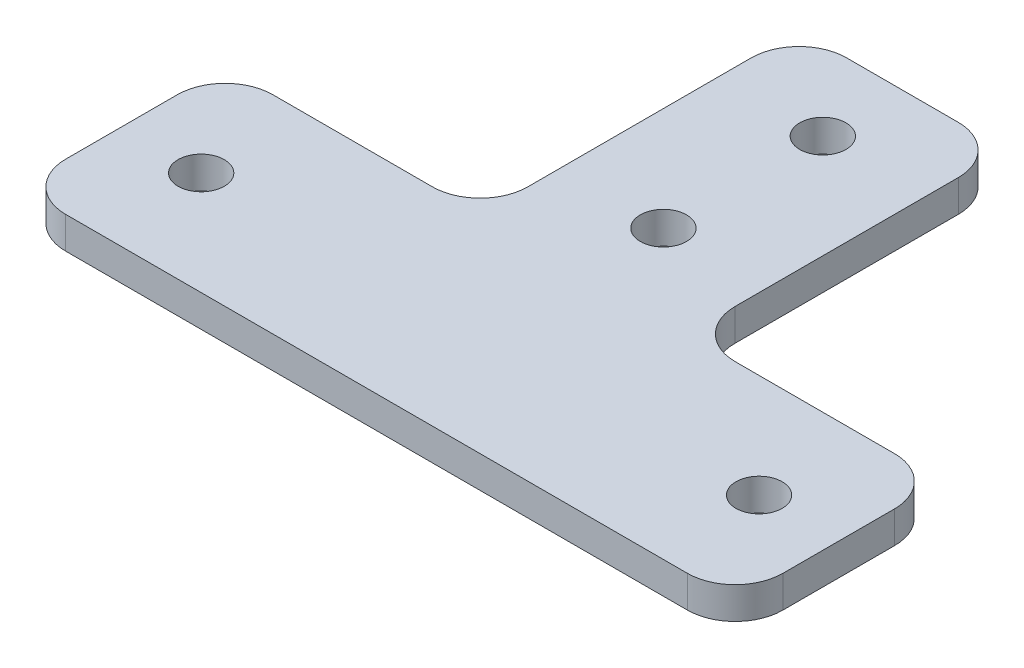
ISO-10303-21;
HEADER;
FILE_DESCRIPTION(('STEP AP214'),'2;1');
FILE_NAME('part.step','',(''),(''),'','','');
FILE_SCHEMA(('AUTOMOTIVE_DESIGN { 1 0 10303 214 1 1 1 1 }'));
ENDSEC;
DATA;
#1=APPLICATION_CONTEXT('core data for automotive mechanical design processes');
#2=APPLICATION_PROTOCOL_DEFINITION('international standard','automotive_design',2000,#1);
#3=PRODUCT_CONTEXT('',#1,'mechanical');
#4=PRODUCT('Part','Part','',(#3));
#5=PRODUCT_RELATED_PRODUCT_CATEGORY('part','',(#4));
#6=PRODUCT_DEFINITION_FORMATION('','',#4);
#7=PRODUCT_DEFINITION_CONTEXT('part definition',#1,'design');
#8=PRODUCT_DEFINITION('design','',#6,#7);
#9=PRODUCT_DEFINITION_SHAPE('','',#8);
#10=(LENGTH_UNIT() NAMED_UNIT(*) SI_UNIT(.MILLI.,.METRE.));
#11=(NAMED_UNIT(*) PLANE_ANGLE_UNIT() SI_UNIT($,.RADIAN.));
#12=(NAMED_UNIT(*) SI_UNIT($,.STERADIAN.) SOLID_ANGLE_UNIT());
#13=UNCERTAINTY_MEASURE_WITH_UNIT(LENGTH_MEASURE(1.E-05),#10,'distance_accuracy_value','');
#14=(GEOMETRIC_REPRESENTATION_CONTEXT(3) GLOBAL_UNCERTAINTY_ASSIGNED_CONTEXT((#13)) GLOBAL_UNIT_ASSIGNED_CONTEXT((#10,
#11,#12)) REPRESENTATION_CONTEXT('',''));
#15=CARTESIAN_POINT('',(0.,0.,0.));
#16=DIRECTION('',(0.,0.,1.));
#17=DIRECTION('',(1.,0.,0.));
#18=AXIS2_PLACEMENT_3D('',#15,#16,#17);
#19=CARTESIAN_POINT('',(0.,2.,0.));
#20=DIRECTION('',(0.,-1.,0.));
#21=DIRECTION('',(0.,0.,-1.));
#22=AXIS2_PLACEMENT_3D('',#19,#20,#21);
#23=PLANE('',#22);
#24=DIRECTION('',(0.,0.,-1.));
#25=VECTOR('',#24,1.);
#26=CARTESIAN_POINT('',(22.5,2.,6.5));
#27=LINE('',#26,#25);
#28=CARTESIAN_POINT('',(22.5,2.,3.5));
#29=VERTEX_POINT('',#28);
#30=CARTESIAN_POINT('',(22.5,2.,-3.5));
#31=VERTEX_POINT('',#30);
#32=EDGE_CURVE('E192',#29,#31,#27,.T.);
#33=ORIENTED_EDGE('',*,*,#32,.T.);
#34=CARTESIAN_POINT('',(19.5,2.,-3.5));
#35=DIRECTION('',(0.,-1.,0.));
#36=DIRECTION('',(0.,0.,-1.));
#37=AXIS2_PLACEMENT_3D('',#34,#35,#36);
#38=CIRCLE('',#37,3.);
#39=CARTESIAN_POINT('',(19.5,2.,-6.5));
#40=VERTEX_POINT('',#39);
#41=EDGE_CURVE('E231',#31,#40,#38,.F.);
#42=ORIENTED_EDGE('',*,*,#41,.T.);
#43=DIRECTION('',(-1.,0.,0.));
#44=VECTOR('',#43,1.);
#45=CARTESIAN_POINT('',(22.5,2.,-6.5));
#46=LINE('',#45,#44);
#47=CARTESIAN_POINT('',(9.49999999999999,2.,-6.5));
#48=VERTEX_POINT('',#47);
#49=EDGE_CURVE('E175',#40,#48,#46,.T.);
#50=ORIENTED_EDGE('',*,*,#49,.T.);
#51=CARTESIAN_POINT('',(9.49999999999999,2.,-9.5));
#52=DIRECTION('',(0.,-1.,0.));
#53=DIRECTION('',(0.,0.,-1.));
#54=AXIS2_PLACEMENT_3D('',#51,#52,#53);
#55=CIRCLE('',#54,3.);
#56=CARTESIAN_POINT('',(6.5,2.,-9.5));
#57=VERTEX_POINT('',#56);
#58=EDGE_CURVE('E11',#48,#57,#55,.T.);
#59=ORIENTED_EDGE('',*,*,#58,.T.);
#60=DIRECTION('',(0.,0.,-1.));
#61=VECTOR('',#60,1.);
#62=CARTESIAN_POINT('',(6.49999999999999,2.,-6.5));
#63=LINE('',#62,#61);
#64=CARTESIAN_POINT('',(6.5,2.,-23.5));
#65=VERTEX_POINT('',#64);
#66=EDGE_CURVE('E309',#57,#65,#63,.T.);
#67=ORIENTED_EDGE('',*,*,#66,.T.);
#68=CARTESIAN_POINT('',(3.5,2.,-23.5));
#69=DIRECTION('',(0.,-1.,0.));
#70=DIRECTION('',(0.,0.,-1.));
#71=AXIS2_PLACEMENT_3D('',#68,#69,#70);
#72=CIRCLE('',#71,3.);
#73=CARTESIAN_POINT('',(3.5,2.,-26.5));
#74=VERTEX_POINT('',#73);
#75=EDGE_CURVE('E222',#65,#74,#72,.F.);
#76=ORIENTED_EDGE('',*,*,#75,.T.);
#77=DIRECTION('',(-1.,0.,0.));
#78=VECTOR('',#77,1.);
#79=CARTESIAN_POINT('',(6.5,2.,-26.5));
#80=LINE('',#79,#78);
#81=CARTESIAN_POINT('',(-3.5,2.,-26.5));
#82=VERTEX_POINT('',#81);
#83=EDGE_CURVE('E299',#74,#82,#80,.T.);
#84=ORIENTED_EDGE('',*,*,#83,.T.);
#85=CARTESIAN_POINT('',(-3.5,2.,-23.5));
#86=DIRECTION('',(0.,-1.,0.));
#87=DIRECTION('',(0.,0.,-1.));
#88=AXIS2_PLACEMENT_3D('',#85,#86,#87);
#89=CIRCLE('',#88,3.);
#90=CARTESIAN_POINT('',(-6.5,2.,-23.5));
#91=VERTEX_POINT('',#90);
#92=EDGE_CURVE('E224',#82,#91,#89,.F.);
#93=ORIENTED_EDGE('',*,*,#92,.T.);
#94=DIRECTION('',(0.,0.,1.));
#95=VECTOR('',#94,1.);
#96=CARTESIAN_POINT('',(-6.5,2.,-26.5));
#97=LINE('',#96,#95);
#98=CARTESIAN_POINT('',(-6.5,2.,-9.5));
#99=VERTEX_POINT('',#98);
#100=EDGE_CURVE('E274',#91,#99,#97,.T.);
#101=ORIENTED_EDGE('',*,*,#100,.T.);
#102=CARTESIAN_POINT('',(-9.49999999999999,2.,-9.5));
#103=DIRECTION('',(0.,-1.,0.));
#104=DIRECTION('',(0.,0.,-1.));
#105=AXIS2_PLACEMENT_3D('',#102,#103,#104);
#106=CIRCLE('',#105,3.);
#107=CARTESIAN_POINT('',(-9.49999999999999,2.,-6.5));
#108=VERTEX_POINT('',#107);
#109=EDGE_CURVE('E264',#99,#108,#106,.T.);
#110=ORIENTED_EDGE('',*,*,#109,.T.);
#111=DIRECTION('',(-1.,0.,0.));
#112=VECTOR('',#111,1.);
#113=CARTESIAN_POINT('',(-6.49999999999999,2.,-6.5));
#114=LINE('',#113,#112);
#115=CARTESIAN_POINT('',(-19.5,2.,-6.5));
#116=VERTEX_POINT('',#115);
#117=EDGE_CURVE('E271',#108,#116,#114,.T.);
#118=ORIENTED_EDGE('',*,*,#117,.T.);
#119=CARTESIAN_POINT('',(-19.5,2.,-3.5));
#120=DIRECTION('',(0.,-1.,0.));
#121=DIRECTION('',(0.,0.,-1.));
#122=AXIS2_PLACEMENT_3D('',#119,#120,#121);
#123=CIRCLE('',#122,3.);
#124=CARTESIAN_POINT('',(-22.5,2.,-3.5));
#125=VERTEX_POINT('',#124);
#126=EDGE_CURVE('E226',#116,#125,#123,.F.);
#127=ORIENTED_EDGE('',*,*,#126,.T.);
#128=DIRECTION('',(0.,0.,1.));
#129=VECTOR('',#128,1.);
#130=CARTESIAN_POINT('',(-22.5,2.,-6.5));
#131=LINE('',#130,#129);
#132=CARTESIAN_POINT('',(-22.5,2.,3.5));
#133=VERTEX_POINT('',#132);
#134=EDGE_CURVE('E282',#125,#133,#131,.T.);
#135=ORIENTED_EDGE('',*,*,#134,.T.);
#136=CARTESIAN_POINT('',(-19.5,2.,3.5));
#137=DIRECTION('',(0.,-1.,0.));
#138=DIRECTION('',(0.,0.,-1.));
#139=AXIS2_PLACEMENT_3D('',#136,#137,#138);
#140=CIRCLE('',#139,3.);
#141=CARTESIAN_POINT('',(-19.5,2.,6.5));
#142=VERTEX_POINT('',#141);
#143=EDGE_CURVE('E63',#133,#142,#140,.F.);
#144=ORIENTED_EDGE('',*,*,#143,.T.);
#145=DIRECTION('',(1.,0.,0.));
#146=VECTOR('',#145,1.);
#147=CARTESIAN_POINT('',(-22.5,2.,6.5));
#148=LINE('',#147,#146);
#149=CARTESIAN_POINT('',(19.5,2.,6.5));
#150=VERTEX_POINT('',#149);
#151=EDGE_CURVE('E318',#142,#150,#148,.T.);
#152=ORIENTED_EDGE('',*,*,#151,.T.);
#153=CARTESIAN_POINT('',(19.5,2.,3.5));
#154=DIRECTION('',(0.,-1.,0.));
#155=DIRECTION('',(0.,0.,-1.));
#156=AXIS2_PLACEMENT_3D('',#153,#154,#155);
#157=CIRCLE('',#156,3.);
#158=EDGE_CURVE('E229',#150,#29,#157,.F.);
#159=ORIENTED_EDGE('',*,*,#158,.T.);
#160=EDGE_LOOP('',(#33,#42,#50,#59,#67,#76,#84,#93,#101,#110,#118,#127,#135,#144,#152,#159));
#161=FACE_BOUND('',#160,.T.);
#162=CARTESIAN_POINT('',(-17.5,2.,0.));
#163=DIRECTION('',(0.,1.,0.));
#164=DIRECTION('',(0.,0.,1.));
#165=AXIS2_PLACEMENT_3D('',#162,#163,#164);
#166=CIRCLE('',#165,1.45);
#167=CARTESIAN_POINT('',(-17.5,2.,1.45));
#168=VERTEX_POINT('',#167);
#169=EDGE_CURVE('E183',#168,#168,#166,.T.);
#170=ORIENTED_EDGE('',*,*,#169,.F.);
#171=EDGE_LOOP('',(#170));
#172=FACE_BOUND('',#171,.T.);
#173=CARTESIAN_POINT('',(17.5,2.,0.));
#174=DIRECTION('',(0.,1.,0.));
#175=DIRECTION('',(0.,0.,1.));
#176=AXIS2_PLACEMENT_3D('',#173,#174,#175);
#177=CIRCLE('',#176,1.45);
#178=CARTESIAN_POINT('',(17.5,2.,1.45));
#179=VERTEX_POINT('',#178);
#180=EDGE_CURVE('E527',#179,#179,#177,.T.);
#181=ORIENTED_EDGE('',*,*,#180,.F.);
#182=EDGE_LOOP('',(#181));
#183=FACE_BOUND('',#182,.T.);
#184=CARTESIAN_POINT('',(0.,2.,-11.5));
#185=DIRECTION('',(0.,1.,0.));
#186=DIRECTION('',(0.,0.,1.));
#187=AXIS2_PLACEMENT_3D('',#184,#185,#186);
#188=CIRCLE('',#187,1.45);
#189=CARTESIAN_POINT('',(0.,2.,-10.05));
#190=VERTEX_POINT('',#189);
#191=EDGE_CURVE('E533',#190,#190,#188,.T.);
#192=ORIENTED_EDGE('',*,*,#191,.F.);
#193=EDGE_LOOP('',(#192));
#194=FACE_BOUND('',#193,.T.);
#195=CARTESIAN_POINT('',(0.,2.,-21.5));
#196=DIRECTION('',(0.,1.,0.));
#197=DIRECTION('',(0.,0.,1.));
#198=AXIS2_PLACEMENT_3D('',#195,#196,#197);
#199=CIRCLE('',#198,1.45);
#200=CARTESIAN_POINT('',(0.,2.,-20.05));
#201=VERTEX_POINT('',#200);
#202=EDGE_CURVE('E539',#201,#201,#199,.T.);
#203=ORIENTED_EDGE('',*,*,#202,.F.);
#204=EDGE_LOOP('',(#203));
#205=FACE_BOUND('',#204,.T.);
#206=ADVANCED_FACE('F41',(#161,#172,#183,#194,#205),#23,.F.);
#207=CARTESIAN_POINT('',(0.,0.,0.));
#208=DIRECTION('',(0.,-1.,0.));
#209=DIRECTION('',(0.,0.,-1.));
#210=AXIS2_PLACEMENT_3D('',#207,#208,#209);
#211=PLANE('',#210);
#212=CARTESIAN_POINT('',(0.,0.,-11.5));
#213=DIRECTION('',(0.,1.,0.));
#214=DIRECTION('',(0.,0.,1.));
#215=AXIS2_PLACEMENT_3D('',#212,#213,#214);
#216=CIRCLE('',#215,1.45);
#217=CARTESIAN_POINT('',(0.,0.,-10.05));
#218=VERTEX_POINT('',#217);
#219=EDGE_CURVE('E536',#218,#218,#216,.T.);
#220=ORIENTED_EDGE('',*,*,#219,.T.);
#221=EDGE_LOOP('',(#220));
#222=FACE_BOUND('',#221,.T.);
#223=CARTESIAN_POINT('',(-17.5,0.,0.));
#224=DIRECTION('',(0.,1.,0.));
#225=DIRECTION('',(0.,0.,1.));
#226=AXIS2_PLACEMENT_3D('',#223,#224,#225);
#227=CIRCLE('',#226,1.45);
#228=CARTESIAN_POINT('',(-17.5,0.,1.45));
#229=VERTEX_POINT('',#228);
#230=EDGE_CURVE('E189',#229,#229,#227,.T.);
#231=ORIENTED_EDGE('',*,*,#230,.T.);
#232=EDGE_LOOP('',(#231));
#233=FACE_BOUND('',#232,.T.);
#234=DIRECTION('',(-1.,0.,0.));
#235=VECTOR('',#234,1.);
#236=CARTESIAN_POINT('',(22.5,0.,-6.5));
#237=LINE('',#236,#235);
#238=CARTESIAN_POINT('',(19.5,0.,-6.5));
#239=VERTEX_POINT('',#238);
#240=CARTESIAN_POINT('',(9.49999999999999,0.,-6.5));
#241=VERTEX_POINT('',#240);
#242=EDGE_CURVE('E172',#239,#241,#237,.T.);
#243=ORIENTED_EDGE('',*,*,#242,.F.);
#244=CARTESIAN_POINT('',(19.5,0.,-3.5));
#245=DIRECTION('',(0.,-1.,0.));
#246=DIRECTION('',(0.,0.,-1.));
#247=AXIS2_PLACEMENT_3D('',#244,#245,#246);
#248=CIRCLE('',#247,3.);
#249=CARTESIAN_POINT('',(22.5,0.,-3.5));
#250=VERTEX_POINT('',#249);
#251=EDGE_CURVE('E155',#239,#250,#248,.T.);
#252=ORIENTED_EDGE('',*,*,#251,.T.);
#253=DIRECTION('',(0.,0.,-1.));
#254=VECTOR('',#253,1.);
#255=CARTESIAN_POINT('',(22.5,0.,6.5));
#256=LINE('',#255,#254);
#257=CARTESIAN_POINT('',(22.5,0.,3.5));
#258=VERTEX_POINT('',#257);
#259=EDGE_CURVE('E208',#258,#250,#256,.T.);
#260=ORIENTED_EDGE('',*,*,#259,.F.);
#261=CARTESIAN_POINT('',(19.5,0.,3.5));
#262=DIRECTION('',(0.,-1.,0.));
#263=DIRECTION('',(0.,0.,-1.));
#264=AXIS2_PLACEMENT_3D('',#261,#262,#263);
#265=CIRCLE('',#264,3.);
#266=CARTESIAN_POINT('',(19.5,0.,6.5));
#267=VERTEX_POINT('',#266);
#268=EDGE_CURVE('E166',#258,#267,#265,.T.);
#269=ORIENTED_EDGE('',*,*,#268,.T.);
#270=DIRECTION('',(1.,0.,0.));
#271=VECTOR('',#270,1.);
#272=CARTESIAN_POINT('',(-22.5,0.,6.5));
#273=LINE('',#272,#271);
#274=CARTESIAN_POINT('',(-19.5,0.,6.5));
#275=VERTEX_POINT('',#274);
#276=EDGE_CURVE('E206',#275,#267,#273,.T.);
#277=ORIENTED_EDGE('',*,*,#276,.F.);
#278=CARTESIAN_POINT('',(-19.5,0.,3.5));
#279=DIRECTION('',(0.,-1.,0.));
#280=DIRECTION('',(0.,0.,-1.));
#281=AXIS2_PLACEMENT_3D('',#278,#279,#280);
#282=CIRCLE('',#281,3.);
#283=CARTESIAN_POINT('',(-22.5,0.,3.5));
#284=VERTEX_POINT('',#283);
#285=EDGE_CURVE('E216',#275,#284,#282,.T.);
#286=ORIENTED_EDGE('',*,*,#285,.T.);
#287=DIRECTION('',(0.,0.,1.));
#288=VECTOR('',#287,1.);
#289=CARTESIAN_POINT('',(-22.5,0.,-6.5));
#290=LINE('',#289,#288);
#291=CARTESIAN_POINT('',(-22.5,0.,-3.5));
#292=VERTEX_POINT('',#291);
#293=EDGE_CURVE('E203',#292,#284,#290,.T.);
#294=ORIENTED_EDGE('',*,*,#293,.F.);
#295=CARTESIAN_POINT('',(-19.5,0.,-3.5));
#296=DIRECTION('',(0.,-1.,0.));
#297=DIRECTION('',(0.,0.,-1.));
#298=AXIS2_PLACEMENT_3D('',#295,#296,#297);
#299=CIRCLE('',#298,3.);
#300=CARTESIAN_POINT('',(-19.5,0.,-6.5));
#301=VERTEX_POINT('',#300);
#302=EDGE_CURVE('E214',#292,#301,#299,.T.);
#303=ORIENTED_EDGE('',*,*,#302,.T.);
#304=DIRECTION('',(-1.,0.,0.));
#305=VECTOR('',#304,1.);
#306=CARTESIAN_POINT('',(-6.49999999999999,0.,-6.5));
#307=LINE('',#306,#305);
#308=CARTESIAN_POINT('',(-9.49999999999999,0.,-6.5));
#309=VERTEX_POINT('',#308);
#310=EDGE_CURVE('E200',#309,#301,#307,.T.);
#311=ORIENTED_EDGE('',*,*,#310,.F.);
#312=CARTESIAN_POINT('',(-9.49999999999999,0.,-9.5));
#313=DIRECTION('',(0.,-1.,0.));
#314=DIRECTION('',(0.,0.,-1.));
#315=AXIS2_PLACEMENT_3D('',#312,#313,#314);
#316=CIRCLE('',#315,3.);
#317=CARTESIAN_POINT('',(-6.5,0.,-9.5));
#318=VERTEX_POINT('',#317);
#319=EDGE_CURVE('E262',#309,#318,#316,.F.);
#320=ORIENTED_EDGE('',*,*,#319,.T.);
#321=DIRECTION('',(0.,0.,1.));
#322=VECTOR('',#321,1.);
#323=CARTESIAN_POINT('',(-6.5,0.,-26.5));
#324=LINE('',#323,#322);
#325=CARTESIAN_POINT('',(-6.5,0.,-23.5));
#326=VERTEX_POINT('',#325);
#327=EDGE_CURVE('E197',#326,#318,#324,.T.);
#328=ORIENTED_EDGE('',*,*,#327,.F.);
#329=CARTESIAN_POINT('',(-3.5,0.,-23.5));
#330=DIRECTION('',(0.,-1.,0.));
#331=DIRECTION('',(0.,0.,-1.));
#332=AXIS2_PLACEMENT_3D('',#329,#330,#331);
#333=CIRCLE('',#332,3.);
#334=CARTESIAN_POINT('',(-3.5,0.,-26.5));
#335=VERTEX_POINT('',#334);
#336=EDGE_CURVE('E212',#326,#335,#333,.T.);
#337=ORIENTED_EDGE('',*,*,#336,.T.);
#338=DIRECTION('',(-1.,0.,0.));
#339=VECTOR('',#338,1.);
#340=CARTESIAN_POINT('',(6.5,0.,-26.5));
#341=LINE('',#340,#339);
#342=CARTESIAN_POINT('',(3.5,0.,-26.5));
#343=VERTEX_POINT('',#342);
#344=EDGE_CURVE('E186',#343,#335,#341,.T.);
#345=ORIENTED_EDGE('',*,*,#344,.F.);
#346=CARTESIAN_POINT('',(3.5,0.,-23.5));
#347=DIRECTION('',(0.,-1.,0.));
#348=DIRECTION('',(0.,0.,-1.));
#349=AXIS2_PLACEMENT_3D('',#346,#347,#348);
#350=CIRCLE('',#349,3.);
#351=CARTESIAN_POINT('',(6.5,0.,-23.5));
#352=VERTEX_POINT('',#351);
#353=EDGE_CURVE('E176',#343,#352,#350,.T.);
#354=ORIENTED_EDGE('',*,*,#353,.T.);
#355=DIRECTION('',(0.,0.,-1.));
#356=VECTOR('',#355,1.);
#357=CARTESIAN_POINT('',(6.49999999999999,0.,-6.5));
#358=LINE('',#357,#356);
#359=CARTESIAN_POINT('',(6.5,0.,-9.5));
#360=VERTEX_POINT('',#359);
#361=EDGE_CURVE('E182',#360,#352,#358,.T.);
#362=ORIENTED_EDGE('',*,*,#361,.F.);
#363=CARTESIAN_POINT('',(9.49999999999999,0.,-9.5));
#364=DIRECTION('',(0.,-1.,0.));
#365=DIRECTION('',(0.,0.,-1.));
#366=AXIS2_PLACEMENT_3D('',#363,#364,#365);
#367=CIRCLE('',#366,3.);
#368=EDGE_CURVE('E49',#360,#241,#367,.F.);
#369=ORIENTED_EDGE('',*,*,#368,.T.);
#370=EDGE_LOOP('',(#243,#252,#260,#269,#277,#286,#294,#303,#311,#320,#328,#337,#345,#354,#362,#369));
#371=FACE_BOUND('',#370,.T.);
#372=CARTESIAN_POINT('',(17.5,0.,0.));
#373=DIRECTION('',(0.,1.,0.));
#374=DIRECTION('',(0.,0.,1.));
#375=AXIS2_PLACEMENT_3D('',#372,#373,#374);
#376=CIRCLE('',#375,1.45);
#377=CARTESIAN_POINT('',(17.5,0.,1.45));
#378=VERTEX_POINT('',#377);
#379=EDGE_CURVE('E529',#378,#378,#376,.T.);
#380=ORIENTED_EDGE('',*,*,#379,.T.);
#381=EDGE_LOOP('',(#380));
#382=FACE_BOUND('',#381,.T.);
#383=CARTESIAN_POINT('',(0.,0.,-21.5));
#384=DIRECTION('',(0.,1.,0.));
#385=DIRECTION('',(0.,0.,1.));
#386=AXIS2_PLACEMENT_3D('',#383,#384,#385);
#387=CIRCLE('',#386,1.45);
#388=CARTESIAN_POINT('',(0.,0.,-20.05));
#389=VERTEX_POINT('',#388);
#390=EDGE_CURVE('E542',#389,#389,#387,.T.);
#391=ORIENTED_EDGE('',*,*,#390,.T.);
#392=EDGE_LOOP('',(#391));
#393=FACE_BOUND('',#392,.T.);
#394=ADVANCED_FACE('F179',(#222,#233,#371,#382,#393),#211,.T.);
#395=CARTESIAN_POINT('',(22.5,2.,-6.5));
#396=DIRECTION('',(0.,0.,1.));
#397=DIRECTION('',(1.,0.,0.));
#398=AXIS2_PLACEMENT_3D('',#395,#396,#397);
#399=PLANE('',#398);
#400=ORIENTED_EDGE('',*,*,#49,.F.);
#401=DIRECTION('',(0.,-1.,0.));
#402=VECTOR('',#401,1.);
#403=CARTESIAN_POINT('',(19.5,2.,-6.5));
#404=LINE('',#403,#402);
#405=EDGE_CURVE('E159',#40,#239,#404,.T.);
#406=ORIENTED_EDGE('',*,*,#405,.T.);
#407=ORIENTED_EDGE('',*,*,#242,.T.);
#408=DIRECTION('',(0.,-1.,0.));
#409=VECTOR('',#408,1.);
#410=CARTESIAN_POINT('',(9.49999999999999,2.,-6.5));
#411=LINE('',#410,#409);
#412=EDGE_CURVE('E177',#241,#48,#411,.F.);
#413=ORIENTED_EDGE('',*,*,#412,.T.);
#414=EDGE_LOOP('',(#400,#406,#407,#413));
#415=FACE_BOUND('',#414,.T.);
#416=ADVANCED_FACE('F171',(#415),#399,.F.);
#417=CARTESIAN_POINT('',(6.49999999999999,2.,-6.5));
#418=DIRECTION('',(-1.,0.,0.));
#419=DIRECTION('',(0.,0.,1.));
#420=AXIS2_PLACEMENT_3D('',#417,#418,#419);
#421=PLANE('',#420);
#422=ORIENTED_EDGE('',*,*,#361,.T.);
#423=DIRECTION('',(0.,-1.,0.));
#424=VECTOR('',#423,1.);
#425=CARTESIAN_POINT('',(6.5,2.,-23.5));
#426=LINE('',#425,#424);
#427=EDGE_CURVE('E260',#352,#65,#426,.F.);
#428=ORIENTED_EDGE('',*,*,#427,.T.);
#429=ORIENTED_EDGE('',*,*,#66,.F.);
#430=DIRECTION('',(0.,-1.,0.));
#431=VECTOR('',#430,1.);
#432=CARTESIAN_POINT('',(6.5,0.,-9.5));
#433=LINE('',#432,#431);
#434=EDGE_CURVE('E257',#57,#360,#433,.T.);
#435=ORIENTED_EDGE('',*,*,#434,.T.);
#436=EDGE_LOOP('',(#422,#428,#429,#435));
#437=FACE_BOUND('',#436,.T.);
#438=ADVANCED_FACE('F305',(#437),#421,.F.);
#439=CARTESIAN_POINT('',(6.5,2.,-26.5));
#440=DIRECTION('',(0.,0.,1.));
#441=DIRECTION('',(1.,0.,0.));
#442=AXIS2_PLACEMENT_3D('',#439,#440,#441);
#443=PLANE('',#442);
#444=ORIENTED_EDGE('',*,*,#344,.T.);
#445=DIRECTION('',(0.,-1.,0.));
#446=VECTOR('',#445,1.);
#447=CARTESIAN_POINT('',(-3.5,2.,-26.5));
#448=LINE('',#447,#446);
#449=EDGE_CURVE('E255',#335,#82,#448,.F.);
#450=ORIENTED_EDGE('',*,*,#449,.T.);
#451=ORIENTED_EDGE('',*,*,#83,.F.);
#452=DIRECTION('',(0.,-1.,0.));
#453=VECTOR('',#452,1.);
#454=CARTESIAN_POINT('',(3.5,2.,-26.5));
#455=LINE('',#454,#453);
#456=EDGE_CURVE('E252',#74,#343,#455,.T.);
#457=ORIENTED_EDGE('',*,*,#456,.T.);
#458=EDGE_LOOP('',(#444,#450,#451,#457));
#459=FACE_BOUND('',#458,.T.);
#460=ADVANCED_FACE('F295',(#459),#443,.F.);
#461=CARTESIAN_POINT('',(-6.5,2.,-26.5));
#462=DIRECTION('',(1.,0.,0.));
#463=DIRECTION('',(0.,0.,-1.));
#464=AXIS2_PLACEMENT_3D('',#461,#462,#463);
#465=PLANE('',#464);
#466=ORIENTED_EDGE('',*,*,#327,.T.);
#467=DIRECTION('',(0.,-1.,0.));
#468=VECTOR('',#467,1.);
#469=CARTESIAN_POINT('',(-6.5,2.,-9.5));
#470=LINE('',#469,#468);
#471=EDGE_CURVE('E250',#318,#99,#470,.F.);
#472=ORIENTED_EDGE('',*,*,#471,.T.);
#473=ORIENTED_EDGE('',*,*,#100,.F.);
#474=DIRECTION('',(0.,-1.,0.));
#475=VECTOR('',#474,1.);
#476=CARTESIAN_POINT('',(-6.5,2.,-23.5));
#477=LINE('',#476,#475);
#478=EDGE_CURVE('E247',#91,#326,#477,.T.);
#479=ORIENTED_EDGE('',*,*,#478,.T.);
#480=EDGE_LOOP('',(#466,#472,#473,#479));
#481=FACE_BOUND('',#480,.T.);
#482=ADVANCED_FACE('F287',(#481),#465,.F.);
#483=CARTESIAN_POINT('',(-6.49999999999999,2.,-6.5));
#484=DIRECTION('',(0.,0.,1.));
#485=DIRECTION('',(1.,0.,0.));
#486=AXIS2_PLACEMENT_3D('',#483,#484,#485);
#487=PLANE('',#486);
#488=ORIENTED_EDGE('',*,*,#310,.T.);
#489=DIRECTION('',(0.,-1.,0.));
#490=VECTOR('',#489,1.);
#491=CARTESIAN_POINT('',(-19.5,2.,-6.5));
#492=LINE('',#491,#490);
#493=EDGE_CURVE('E245',#301,#116,#492,.F.);
#494=ORIENTED_EDGE('',*,*,#493,.T.);
#495=ORIENTED_EDGE('',*,*,#117,.F.);
#496=DIRECTION('',(0.,-1.,0.));
#497=VECTOR('',#496,1.);
#498=CARTESIAN_POINT('',(-9.49999999999999,0.,-6.5));
#499=LINE('',#498,#497);
#500=EDGE_CURVE('E242',#108,#309,#499,.T.);
#501=ORIENTED_EDGE('',*,*,#500,.T.);
#502=EDGE_LOOP('',(#488,#494,#495,#501));
#503=FACE_BOUND('',#502,.T.);
#504=ADVANCED_FACE('F279',(#503),#487,.F.);
#505=CARTESIAN_POINT('',(-22.5,2.,-6.5));
#506=DIRECTION('',(1.,0.,0.));
#507=DIRECTION('',(0.,0.,-1.));
#508=AXIS2_PLACEMENT_3D('',#505,#506,#507);
#509=PLANE('',#508);
#510=ORIENTED_EDGE('',*,*,#293,.T.);
#511=DIRECTION('',(0.,-1.,0.));
#512=VECTOR('',#511,1.);
#513=CARTESIAN_POINT('',(-22.5,2.,3.5));
#514=LINE('',#513,#512);
#515=EDGE_CURVE('E240',#284,#133,#514,.F.);
#516=ORIENTED_EDGE('',*,*,#515,.T.);
#517=ORIENTED_EDGE('',*,*,#134,.F.);
#518=DIRECTION('',(0.,-1.,0.));
#519=VECTOR('',#518,1.);
#520=CARTESIAN_POINT('',(-22.5,2.,-3.5));
#521=LINE('',#520,#519);
#522=EDGE_CURVE('E237',#125,#292,#521,.T.);
#523=ORIENTED_EDGE('',*,*,#522,.T.);
#524=EDGE_LOOP('',(#510,#516,#517,#523));
#525=FACE_BOUND('',#524,.T.);
#526=ADVANCED_FACE('F334',(#525),#509,.F.);
#527=CARTESIAN_POINT('',(-22.5,2.,6.5));
#528=DIRECTION('',(0.,0.,-1.));
#529=DIRECTION('',(-1.,0.,0.));
#530=AXIS2_PLACEMENT_3D('',#527,#528,#529);
#531=PLANE('',#530);
#532=ORIENTED_EDGE('',*,*,#276,.T.);
#533=DIRECTION('',(0.,-1.,0.));
#534=VECTOR('',#533,1.);
#535=CARTESIAN_POINT('',(19.5,2.,6.5));
#536=LINE('',#535,#534);
#537=EDGE_CURVE('E56',#267,#150,#536,.F.);
#538=ORIENTED_EDGE('',*,*,#537,.T.);
#539=ORIENTED_EDGE('',*,*,#151,.F.);
#540=DIRECTION('',(0.,-1.,0.));
#541=VECTOR('',#540,1.);
#542=CARTESIAN_POINT('',(-19.5,2.,6.5));
#543=LINE('',#542,#541);
#544=EDGE_CURVE('E233',#142,#275,#543,.T.);
#545=ORIENTED_EDGE('',*,*,#544,.T.);
#546=EDGE_LOOP('',(#532,#538,#539,#545));
#547=FACE_BOUND('',#546,.T.);
#548=ADVANCED_FACE('F327',(#547),#531,.F.);
#549=CARTESIAN_POINT('',(22.5,2.,6.5));
#550=DIRECTION('',(-1.,0.,0.));
#551=DIRECTION('',(0.,0.,1.));
#552=AXIS2_PLACEMENT_3D('',#549,#550,#551);
#553=PLANE('',#552);
#554=ORIENTED_EDGE('',*,*,#259,.T.);
#555=DIRECTION('',(0.,-1.,0.));
#556=VECTOR('',#555,1.);
#557=CARTESIAN_POINT('',(22.5,2.,-3.5));
#558=LINE('',#557,#556);
#559=EDGE_CURVE('E160',#250,#31,#558,.F.);
#560=ORIENTED_EDGE('',*,*,#559,.T.);
#561=ORIENTED_EDGE('',*,*,#32,.F.);
#562=DIRECTION('',(0.,-1.,0.));
#563=VECTOR('',#562,1.);
#564=CARTESIAN_POINT('',(22.5,2.,3.5));
#565=LINE('',#564,#563);
#566=EDGE_CURVE('E165',#29,#258,#565,.T.);
#567=ORIENTED_EDGE('',*,*,#566,.T.);
#568=EDGE_LOOP('',(#554,#560,#561,#567));
#569=FACE_BOUND('',#568,.T.);
#570=ADVANCED_FACE('F323',(#569),#553,.F.);
#571=CARTESIAN_POINT('',(-17.5,2.,0.));
#572=DIRECTION('',(0.,-1.,0.));
#573=DIRECTION('',(0.,0.,-1.));
#574=AXIS2_PLACEMENT_3D('',#571,#572,#573);
#575=CYLINDRICAL_SURFACE('',#574,1.45);
#576=ORIENTED_EDGE('',*,*,#169,.T.);
#577=EDGE_LOOP('',(#576));
#578=FACE_BOUND('',#577,.T.);
#579=ORIENTED_EDGE('',*,*,#230,.F.);
#580=EDGE_LOOP('',(#579));
#581=FACE_BOUND('',#580,.T.);
#582=ADVANCED_FACE('F356',(#578,#581),#575,.F.);
#583=CARTESIAN_POINT('',(17.5,2.,0.));
#584=DIRECTION('',(0.,-1.,0.));
#585=DIRECTION('',(0.,0.,-1.));
#586=AXIS2_PLACEMENT_3D('',#583,#584,#585);
#587=CYLINDRICAL_SURFACE('',#586,1.45);
#588=ORIENTED_EDGE('',*,*,#180,.T.);
#589=EDGE_LOOP('',(#588));
#590=FACE_BOUND('',#589,.T.);
#591=ORIENTED_EDGE('',*,*,#379,.F.);
#592=EDGE_LOOP('',(#591));
#593=FACE_BOUND('',#592,.T.);
#594=ADVANCED_FACE('F442',(#590,#593),#587,.F.);
#595=CARTESIAN_POINT('',(0.,2.,-11.5));
#596=DIRECTION('',(0.,-1.,0.));
#597=DIRECTION('',(0.,0.,-1.));
#598=AXIS2_PLACEMENT_3D('',#595,#596,#597);
#599=CYLINDRICAL_SURFACE('',#598,1.45);
#600=ORIENTED_EDGE('',*,*,#191,.T.);
#601=EDGE_LOOP('',(#600));
#602=FACE_BOUND('',#601,.T.);
#603=ORIENTED_EDGE('',*,*,#219,.F.);
#604=EDGE_LOOP('',(#603));
#605=FACE_BOUND('',#604,.T.);
#606=ADVANCED_FACE('F433',(#602,#605),#599,.F.);
#607=CARTESIAN_POINT('',(0.,2.,-21.5));
#608=DIRECTION('',(0.,-1.,0.));
#609=DIRECTION('',(0.,0.,-1.));
#610=AXIS2_PLACEMENT_3D('',#607,#608,#609);
#611=CYLINDRICAL_SURFACE('',#610,1.45);
#612=ORIENTED_EDGE('',*,*,#202,.T.);
#613=EDGE_LOOP('',(#612));
#614=FACE_BOUND('',#613,.T.);
#615=ORIENTED_EDGE('',*,*,#390,.F.);
#616=EDGE_LOOP('',(#615));
#617=FACE_BOUND('',#616,.T.);
#618=ADVANCED_FACE('F377',(#614,#617),#611,.F.);
#619=CARTESIAN_POINT('',(19.5,2.,-3.5));
#620=DIRECTION('',(0.,-1.,0.));
#621=DIRECTION('',(0.,0.,-1.));
#622=AXIS2_PLACEMENT_3D('',#619,#620,#621);
#623=CYLINDRICAL_SURFACE('',#622,3.);
#624=ORIENTED_EDGE('',*,*,#41,.F.);
#625=ORIENTED_EDGE('',*,*,#559,.F.);
#626=ORIENTED_EDGE('',*,*,#251,.F.);
#627=ORIENTED_EDGE('',*,*,#405,.F.);
#628=EDGE_LOOP('',(#624,#625,#626,#627));
#629=FACE_BOUND('',#628,.T.);
#630=ADVANCED_FACE('F158',(#629),#623,.T.);
#631=CARTESIAN_POINT('',(19.5,2.,3.5));
#632=DIRECTION('',(0.,-1.,0.));
#633=DIRECTION('',(0.,0.,-1.));
#634=AXIS2_PLACEMENT_3D('',#631,#632,#633);
#635=CYLINDRICAL_SURFACE('',#634,3.);
#636=ORIENTED_EDGE('',*,*,#158,.F.);
#637=ORIENTED_EDGE('',*,*,#537,.F.);
#638=ORIENTED_EDGE('',*,*,#268,.F.);
#639=ORIENTED_EDGE('',*,*,#566,.F.);
#640=EDGE_LOOP('',(#636,#637,#638,#639));
#641=FACE_BOUND('',#640,.T.);
#642=ADVANCED_FACE('F325',(#641),#635,.T.);
#643=CARTESIAN_POINT('',(-19.5,2.,3.5));
#644=DIRECTION('',(0.,-1.,0.));
#645=DIRECTION('',(0.,0.,-1.));
#646=AXIS2_PLACEMENT_3D('',#643,#644,#645);
#647=CYLINDRICAL_SURFACE('',#646,3.);
#648=ORIENTED_EDGE('',*,*,#143,.F.);
#649=ORIENTED_EDGE('',*,*,#515,.F.);
#650=ORIENTED_EDGE('',*,*,#285,.F.);
#651=ORIENTED_EDGE('',*,*,#544,.F.);
#652=EDGE_LOOP('',(#648,#649,#650,#651));
#653=FACE_BOUND('',#652,.T.);
#654=ADVANCED_FACE('F330',(#653),#647,.T.);
#655=CARTESIAN_POINT('',(-19.5,2.,-3.5));
#656=DIRECTION('',(0.,-1.,0.));
#657=DIRECTION('',(0.,0.,-1.));
#658=AXIS2_PLACEMENT_3D('',#655,#656,#657);
#659=CYLINDRICAL_SURFACE('',#658,3.);
#660=ORIENTED_EDGE('',*,*,#126,.F.);
#661=ORIENTED_EDGE('',*,*,#493,.F.);
#662=ORIENTED_EDGE('',*,*,#302,.F.);
#663=ORIENTED_EDGE('',*,*,#522,.F.);
#664=EDGE_LOOP('',(#660,#661,#662,#663));
#665=FACE_BOUND('',#664,.T.);
#666=ADVANCED_FACE('F338',(#665),#659,.T.);
#667=CARTESIAN_POINT('',(-9.49999999999999,2.,-9.5));
#668=DIRECTION('',(0.,1.,0.));
#669=DIRECTION('',(0.,0.,1.));
#670=AXIS2_PLACEMENT_3D('',#667,#668,#669);
#671=CYLINDRICAL_SURFACE('',#670,3.);
#672=ORIENTED_EDGE('',*,*,#109,.F.);
#673=ORIENTED_EDGE('',*,*,#471,.F.);
#674=ORIENTED_EDGE('',*,*,#319,.F.);
#675=ORIENTED_EDGE('',*,*,#500,.F.);
#676=EDGE_LOOP('',(#672,#673,#674,#675));
#677=FACE_BOUND('',#676,.T.);
#678=ADVANCED_FACE('F284',(#677),#671,.F.);
#679=CARTESIAN_POINT('',(-3.5,2.,-23.5));
#680=DIRECTION('',(0.,-1.,0.));
#681=DIRECTION('',(0.,0.,-1.));
#682=AXIS2_PLACEMENT_3D('',#679,#680,#681);
#683=CYLINDRICAL_SURFACE('',#682,3.);
#684=ORIENTED_EDGE('',*,*,#92,.F.);
#685=ORIENTED_EDGE('',*,*,#449,.F.);
#686=ORIENTED_EDGE('',*,*,#336,.F.);
#687=ORIENTED_EDGE('',*,*,#478,.F.);
#688=EDGE_LOOP('',(#684,#685,#686,#687));
#689=FACE_BOUND('',#688,.T.);
#690=ADVANCED_FACE('F291',(#689),#683,.T.);
#691=CARTESIAN_POINT('',(3.5,2.,-23.5));
#692=DIRECTION('',(0.,-1.,0.));
#693=DIRECTION('',(0.,0.,-1.));
#694=AXIS2_PLACEMENT_3D('',#691,#692,#693);
#695=CYLINDRICAL_SURFACE('',#694,3.);
#696=ORIENTED_EDGE('',*,*,#75,.F.);
#697=ORIENTED_EDGE('',*,*,#427,.F.);
#698=ORIENTED_EDGE('',*,*,#353,.F.);
#699=ORIENTED_EDGE('',*,*,#456,.F.);
#700=EDGE_LOOP('',(#696,#697,#698,#699));
#701=FACE_BOUND('',#700,.T.);
#702=ADVANCED_FACE('F302',(#701),#695,.T.);
#703=CARTESIAN_POINT('',(9.49999999999999,2.,-9.5));
#704=DIRECTION('',(0.,1.,0.));
#705=DIRECTION('',(0.,0.,1.));
#706=AXIS2_PLACEMENT_3D('',#703,#704,#705);
#707=CYLINDRICAL_SURFACE('',#706,3.);
#708=ORIENTED_EDGE('',*,*,#58,.F.);
#709=ORIENTED_EDGE('',*,*,#412,.F.);
#710=ORIENTED_EDGE('',*,*,#368,.F.);
#711=ORIENTED_EDGE('',*,*,#434,.F.);
#712=EDGE_LOOP('',(#708,#709,#710,#711));
#713=FACE_BOUND('',#712,.T.);
#714=ADVANCED_FACE('F43',(#713),#707,.F.);
#715=CLOSED_SHELL('',(#206,#394,#416,#438,#460,#482,#504,#526,#548,#570,#582,#594,#606,#618,
#630,#642,#654,#666,#678,#690,#702,#714));
#716=MANIFOLD_SOLID_BREP('B2',#715);
#717=ADVANCED_BREP_SHAPE_REPRESENTATION('',(#18,#716),#14);
#718=SHAPE_DEFINITION_REPRESENTATION(#9,#717);
ENDSEC;
END-ISO-10303-21;
